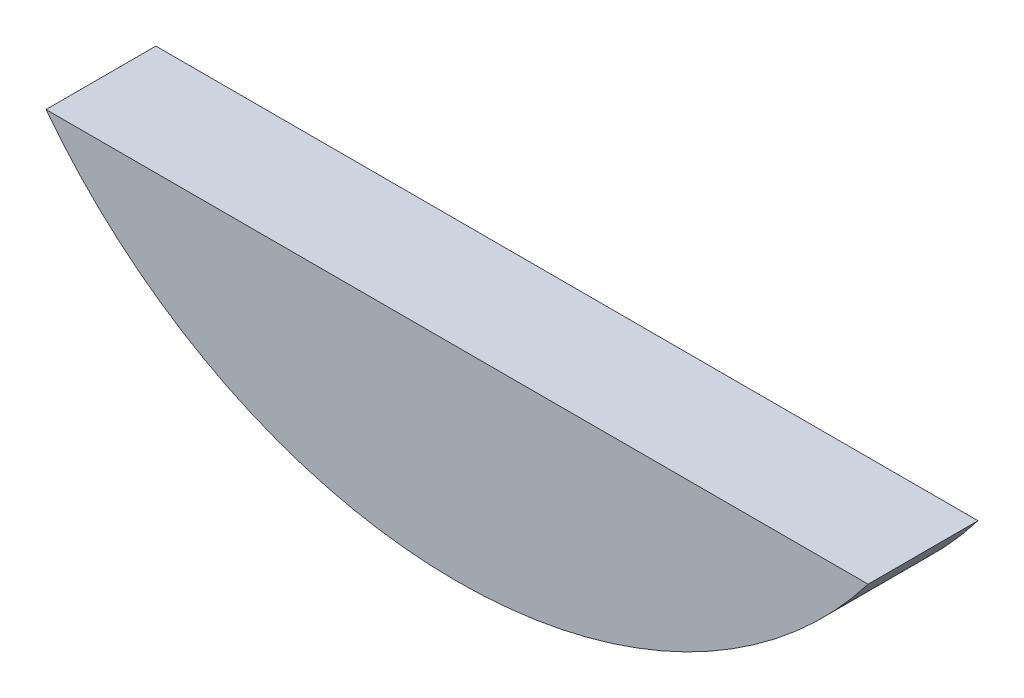
ISO-10303-21;
HEADER;
FILE_DESCRIPTION(('STEP AP214'),'2;1');
FILE_NAME('part.step','',(''),(''),'','','');
FILE_SCHEMA(('AUTOMOTIVE_DESIGN { 1 0 10303 214 1 1 1 1 }'));
ENDSEC;
DATA;
#1=APPLICATION_CONTEXT('core data for automotive mechanical design processes');
#2=APPLICATION_PROTOCOL_DEFINITION('international standard','automotive_design',2000,#1);
#3=PRODUCT_CONTEXT('',#1,'mechanical');
#4=PRODUCT('Part','Part','',(#3));
#5=PRODUCT_RELATED_PRODUCT_CATEGORY('part','',(#4));
#6=PRODUCT_DEFINITION_FORMATION('','',#4);
#7=PRODUCT_DEFINITION_CONTEXT('part definition',#1,'design');
#8=PRODUCT_DEFINITION('design','',#6,#7);
#9=PRODUCT_DEFINITION_SHAPE('','',#8);
#10=(LENGTH_UNIT() NAMED_UNIT(*) SI_UNIT(.MILLI.,.METRE.));
#11=(NAMED_UNIT(*) PLANE_ANGLE_UNIT() SI_UNIT($,.RADIAN.));
#12=(NAMED_UNIT(*) SI_UNIT($,.STERADIAN.) SOLID_ANGLE_UNIT());
#13=UNCERTAINTY_MEASURE_WITH_UNIT(LENGTH_MEASURE(1.E-05),#10,'distance_accuracy_value','');
#14=(GEOMETRIC_REPRESENTATION_CONTEXT(3) GLOBAL_UNCERTAINTY_ASSIGNED_CONTEXT((#13)) GLOBAL_UNIT_ASSIGNED_CONTEXT((#10,
#11,#12)) REPRESENTATION_CONTEXT('',''));
#15=CARTESIAN_POINT('',(0.,0.,0.));
#16=DIRECTION('',(0.,0.,1.));
#17=DIRECTION('',(1.,0.,0.));
#18=AXIS2_PLACEMENT_3D('',#15,#16,#17);
#19=CARTESIAN_POINT('',(-38.2132480426785,-5.87066719343403,0.));
#20=DIRECTION('',(0.,0.,-1.));
#21=DIRECTION('',(-1.,0.,0.));
#22=AXIS2_PLACEMENT_3D('',#19,#20,#21);
#23=PLANE('',#22);
#24=CARTESIAN_POINT('',(1.31056256658607,-3.52589015280131,0.));
#25=DIRECTION('',(0.,0.,1.));
#26=DIRECTION('',(1.,0.,0.));
#27=AXIS2_PLACEMENT_3D('',#24,#25,#26);
#28=CIRCLE('',#27,0.264962664518373);
#29=CARTESIAN_POINT('',(1.16239934406755,-3.74555551894173,0.));
#30=VERTEX_POINT('',#29);
#31=CARTESIAN_POINT('',(1.40794161013052,-3.27947072283069,0.));
#32=VERTEX_POINT('',#31);
#33=EDGE_CURVE('P0_E20',#30,#32,#28,.F.);
#34=ORIENTED_EDGE('',*,*,#33,.F.);
#35=CARTESIAN_POINT('',(0.,-5.72703044701187,0.));
#36=DIRECTION('',(0.,0.,1.));
#37=DIRECTION('',(1.,0.,0.));
#38=AXIS2_PLACEMENT_3D('',#35,#36,#37);
#39=CIRCLE('',#38,2.29726252867608);
#40=CARTESIAN_POINT('',(-1.16239934406755,-3.74555551894173,0.));
#41=VERTEX_POINT('',#40);
#42=EDGE_CURVE('P0_E72',#30,#41,#39,.F.);
#43=ORIENTED_EDGE('',*,*,#42,.T.);
#44=CARTESIAN_POINT('',(-1.31056256658607,-3.52589015280131,0.));
#45=DIRECTION('',(0.,0.,1.));
#46=DIRECTION('',(1.,0.,0.));
#47=AXIS2_PLACEMENT_3D('',#44,#45,#46);
#48=CIRCLE('',#47,0.264962664518373);
#49=CARTESIAN_POINT('',(-1.40794161013052,-3.27947072283069,0.));
#50=VERTEX_POINT('',#49);
#51=EDGE_CURVE('P0_E57',#50,#41,#48,.F.);
#52=ORIENTED_EDGE('',*,*,#51,.F.);
#53=CARTESIAN_POINT('',(0.,-5.72703044701187,0.));
#54=DIRECTION('',(0.,0.,1.));
#55=DIRECTION('',(1.,0.,0.));
#56=AXIS2_PLACEMENT_3D('',#53,#54,#55);
#57=CIRCLE('',#56,2.82362323637038);
#58=EDGE_CURVE('P0_E55',#32,#50,#57,.F.);
#59=ORIENTED_EDGE('',*,*,#58,.F.);
#60=EDGE_LOOP('',(#34,#43,#52,#59));
#61=FACE_BOUND('',#60,.T.);
#62=ADVANCED_FACE('P0_F17',(#61),#23,.F.);
#63=CARTESIAN_POINT('',(0.,-5.72703044701187,-0.0254));
#64=DIRECTION('',(0.,0.,1.));
#65=DIRECTION('',(1.,0.,0.));
#66=AXIS2_PLACEMENT_3D('',#63,#64,#65);
#67=CYLINDRICAL_SURFACE('',#66,2.82362323637038);
#68=ORIENTED_EDGE('',*,*,#58,.T.);
#69=DIRECTION('',(0.,0.,1.));
#70=VECTOR('',#69,1.);
#71=CARTESIAN_POINT('',(-1.40794161013052,-3.27947072283069,-0.0254));
#72=LINE('',#71,#70);
#73=CARTESIAN_POINT('',(-1.40794161013052,-3.27947072283069,-0.0254));
#74=VERTEX_POINT('',#73);
#75=EDGE_CURVE('P0_E62',#74,#50,#72,.T.);
#76=ORIENTED_EDGE('',*,*,#75,.F.);
#77=CARTESIAN_POINT('',(0.,-5.72703044701187,-0.0254));
#78=DIRECTION('',(0.,0.,1.));
#79=DIRECTION('',(1.,0.,0.));
#80=AXIS2_PLACEMENT_3D('',#77,#78,#79);
#81=CIRCLE('',#80,2.82362323637038);
#82=CARTESIAN_POINT('',(1.40794161013052,-3.27947072283069,-0.0254));
#83=VERTEX_POINT('',#82);
#84=EDGE_CURVE('P0_E71',#83,#74,#81,.F.);
#85=ORIENTED_EDGE('',*,*,#84,.F.);
#86=DIRECTION('',(0.,0.,1.));
#87=VECTOR('',#86,1.);
#88=CARTESIAN_POINT('',(1.40794161013052,-3.27947072283069,-0.0254));
#89=LINE('',#88,#87);
#90=EDGE_CURVE('P0_E68',#32,#83,#89,.F.);
#91=ORIENTED_EDGE('',*,*,#90,.F.);
#92=EDGE_LOOP('',(#68,#76,#85,#91));
#93=FACE_BOUND('',#92,.T.);
#94=ADVANCED_FACE('P0_F70',(#93),#67,.T.);
#95=CARTESIAN_POINT('',(-1.31056256658607,-3.52589015280131,-0.0254));
#96=DIRECTION('',(0.,0.,1.));
#97=DIRECTION('',(1.,0.,0.));
#98=AXIS2_PLACEMENT_3D('',#95,#96,#97);
#99=CYLINDRICAL_SURFACE('',#98,0.264962664518373);
#100=ORIENTED_EDGE('',*,*,#51,.T.);
#101=DIRECTION('',(0.,0.,1.));
#102=VECTOR('',#101,1.);
#103=CARTESIAN_POINT('',(-1.16239934406755,-3.74555551894173,-0.0254));
#104=LINE('',#103,#102);
#105=CARTESIAN_POINT('',(-1.16239934406755,-3.74555551894173,-0.0254));
#106=VERTEX_POINT('',#105);
#107=EDGE_CURVE('P0_E75',#41,#106,#104,.F.);
#108=ORIENTED_EDGE('',*,*,#107,.T.);
#109=CARTESIAN_POINT('',(-1.31056256658607,-3.52589015280131,-0.0254));
#110=DIRECTION('',(0.,0.,1.));
#111=DIRECTION('',(1.,0.,0.));
#112=AXIS2_PLACEMENT_3D('',#109,#110,#111);
#113=CIRCLE('',#112,0.264962664518373);
#114=EDGE_CURVE('P0_E82',#74,#106,#113,.F.);
#115=ORIENTED_EDGE('',*,*,#114,.F.);
#116=ORIENTED_EDGE('',*,*,#75,.T.);
#117=EDGE_LOOP('',(#100,#108,#115,#116));
#118=FACE_BOUND('',#117,.T.);
#119=ADVANCED_FACE('P0_F87',(#118),#99,.T.);
#120=CARTESIAN_POINT('',(0.,-5.72703044701187,-0.0254));
#121=DIRECTION('',(0.,0.,1.));
#122=DIRECTION('',(1.,0.,0.));
#123=AXIS2_PLACEMENT_3D('',#120,#121,#122);
#124=CYLINDRICAL_SURFACE('',#123,2.29726252867608);
#125=DIRECTION('',(0.,0.,1.));
#126=VECTOR('',#125,1.);
#127=CARTESIAN_POINT('',(1.16239934406755,-3.74555551894173,-0.0254));
#128=LINE('',#127,#126);
#129=CARTESIAN_POINT('',(1.16239934406755,-3.74555551894173,-0.0254));
#130=VERTEX_POINT('',#129);
#131=EDGE_CURVE('P0_E69',#130,#30,#128,.T.);
#132=ORIENTED_EDGE('',*,*,#131,.F.);
#133=CARTESIAN_POINT('',(0.,-5.72703044701187,-0.0254));
#134=DIRECTION('',(0.,0.,1.));
#135=DIRECTION('',(1.,0.,0.));
#136=AXIS2_PLACEMENT_3D('',#133,#134,#135);
#137=CIRCLE('',#136,2.29726252867608);
#138=EDGE_CURVE('P0_E26',#106,#130,#137,.T.);
#139=ORIENTED_EDGE('',*,*,#138,.F.);
#140=ORIENTED_EDGE('',*,*,#107,.F.);
#141=ORIENTED_EDGE('',*,*,#42,.F.);
#142=EDGE_LOOP('',(#132,#139,#140,#141));
#143=FACE_BOUND('',#142,.T.);
#144=ADVANCED_FACE('P0_F90',(#143),#124,.F.);
#145=CARTESIAN_POINT('',(1.31056256658607,-3.52589015280131,-0.0254));
#146=DIRECTION('',(0.,0.,1.));
#147=DIRECTION('',(1.,0.,0.));
#148=AXIS2_PLACEMENT_3D('',#145,#146,#147);
#149=CYLINDRICAL_SURFACE('',#148,0.264962664518373);
#150=CARTESIAN_POINT('',(1.31056256658607,-3.52589015280131,-0.0254));
#151=DIRECTION('',(0.,0.,1.));
#152=DIRECTION('',(1.,0.,0.));
#153=AXIS2_PLACEMENT_3D('',#150,#151,#152);
#154=CIRCLE('',#153,0.264962664518373);
#155=EDGE_CURVE('P0_E11',#130,#83,#154,.F.);
#156=ORIENTED_EDGE('',*,*,#155,.F.);
#157=ORIENTED_EDGE('',*,*,#131,.T.);
#158=ORIENTED_EDGE('',*,*,#33,.T.);
#159=ORIENTED_EDGE('',*,*,#90,.T.);
#160=EDGE_LOOP('',(#156,#157,#158,#159));
#161=FACE_BOUND('',#160,.T.);
#162=ADVANCED_FACE('P0_F67',(#161),#149,.T.);
#163=CARTESIAN_POINT('',(-38.2132480426785,-5.87066719343403,-0.0254));
#164=DIRECTION('',(0.,0.,-1.));
#165=DIRECTION('',(-1.,0.,0.));
#166=AXIS2_PLACEMENT_3D('',#163,#164,#165);
#167=PLANE('',#166);
#168=ORIENTED_EDGE('',*,*,#138,.T.);
#169=ORIENTED_EDGE('',*,*,#155,.T.);
#170=ORIENTED_EDGE('',*,*,#84,.T.);
#171=ORIENTED_EDGE('',*,*,#114,.T.);
#172=EDGE_LOOP('',(#168,#169,#170,#171));
#173=FACE_BOUND('',#172,.T.);
#174=ADVANCED_FACE('P0_F91',(#173),#167,.T.);
#175=CLOSED_SHELL('',(#62,#94,#119,#144,#162,#174));
#176=MANIFOLD_SOLID_BREP('P0_B1',#175);
#177=CARTESIAN_POINT('',(0.,-53.3944236345631,0.));
#178=DIRECTION('',(0.,0.,1.));
#179=DIRECTION('',(1.,0.,0.));
#180=AXIS2_PLACEMENT_3D('',#177,#178,#179);
#181=PLANE('',#180);
#182=CARTESIAN_POINT('',(0.,18.1677984931941,0.));
#183=DIRECTION('',(0.,0.,-1.));
#184=DIRECTION('',(-1.,0.,0.));
#185=AXIS2_PLACEMENT_3D('',#182,#183,#184);
#186=CIRCLE('',#185,29.9091328800622);
#187=CARTESIAN_POINT('',(-23.7589420544752,0.,0.));
#188=VERTEX_POINT('',#187);
#189=CARTESIAN_POINT('',(23.7589420544752,0.,0.));
#190=VERTEX_POINT('',#189);
#191=EDGE_CURVE('P1_E20',#188,#190,#186,.F.);
#192=ORIENTED_EDGE('',*,*,#191,.F.);
#193=DIRECTION('',(1.,0.,0.));
#194=VECTOR('',#193,1.);
#195=CARTESIAN_POINT('',(0.,0.,0.));
#196=LINE('',#195,#194);
#197=EDGE_CURVE('P1_E42',#190,#188,#196,.F.);
#198=ORIENTED_EDGE('',*,*,#197,.F.);
#199=EDGE_LOOP('',(#192,#198));
#200=FACE_BOUND('',#199,.T.);
#201=ADVANCED_FACE('P1_F17',(#200),#181,.F.);
#202=CARTESIAN_POINT('',(0.,0.,6.35));
#203=DIRECTION('',(0.,1.,0.));
#204=DIRECTION('',(0.,0.,1.));
#205=AXIS2_PLACEMENT_3D('',#202,#203,#204);
#206=PLANE('',#205);
#207=DIRECTION('',(1.,0.,0.));
#208=VECTOR('',#207,1.);
#209=CARTESIAN_POINT('',(0.,0.,6.35));
#210=LINE('',#209,#208);
#211=CARTESIAN_POINT('',(23.7589420544752,0.,6.35));
#212=VERTEX_POINT('',#211);
#213=CARTESIAN_POINT('',(-23.7589420544752,0.,6.35));
#214=VERTEX_POINT('',#213);
#215=EDGE_CURVE('P1_E26',#212,#214,#210,.F.);
#216=ORIENTED_EDGE('',*,*,#215,.F.);
#217=DIRECTION('',(0.,0.,-1.));
#218=VECTOR('',#217,1.);
#219=CARTESIAN_POINT('',(23.7589420544752,0.,6.35));
#220=LINE('',#219,#218);
#221=EDGE_CURVE('P1_E46',#190,#212,#220,.F.);
#222=ORIENTED_EDGE('',*,*,#221,.F.);
#223=ORIENTED_EDGE('',*,*,#197,.T.);
#224=DIRECTION('',(0.,0.,-1.));
#225=VECTOR('',#224,1.);
#226=CARTESIAN_POINT('',(-23.7589420544752,0.,6.35));
#227=LINE('',#226,#225);
#228=EDGE_CURVE('P1_E34',#214,#188,#227,.T.);
#229=ORIENTED_EDGE('',*,*,#228,.F.);
#230=EDGE_LOOP('',(#216,#222,#223,#229));
#231=FACE_BOUND('',#230,.T.);
#232=ADVANCED_FACE('P1_F47',(#231),#206,.T.);
#233=CARTESIAN_POINT('',(0.,18.1677984931941,6.35));
#234=DIRECTION('',(0.,0.,-1.));
#235=DIRECTION('',(-1.,0.,0.));
#236=AXIS2_PLACEMENT_3D('',#233,#234,#235);
#237=CYLINDRICAL_SURFACE('',#236,29.9091328800622);
#238=CARTESIAN_POINT('',(0.,18.1677984931941,6.35));
#239=DIRECTION('',(0.,0.,-1.));
#240=DIRECTION('',(-1.,0.,0.));
#241=AXIS2_PLACEMENT_3D('',#238,#239,#240);
#242=CIRCLE('',#241,29.9091328800622);
#243=EDGE_CURVE('P1_E11',#214,#212,#242,.F.);
#244=ORIENTED_EDGE('',*,*,#243,.F.);
#245=ORIENTED_EDGE('',*,*,#228,.T.);
#246=ORIENTED_EDGE('',*,*,#191,.T.);
#247=ORIENTED_EDGE('',*,*,#221,.T.);
#248=EDGE_LOOP('',(#244,#245,#246,#247));
#249=FACE_BOUND('',#248,.T.);
#250=ADVANCED_FACE('P1_F51',(#249),#237,.T.);
#251=CARTESIAN_POINT('',(0.,-53.3944236345631,6.35));
#252=DIRECTION('',(0.,0.,1.));
#253=DIRECTION('',(1.,0.,0.));
#254=AXIS2_PLACEMENT_3D('',#251,#252,#253);
#255=PLANE('',#254);
#256=ORIENTED_EDGE('',*,*,#215,.T.);
#257=ORIENTED_EDGE('',*,*,#243,.T.);
#258=EDGE_LOOP('',(#256,#257));
#259=FACE_BOUND('',#258,.T.);
#260=ADVANCED_FACE('P1_F55',(#259),#255,.T.);
#261=CLOSED_SHELL('',(#201,#232,#250,#260));
#262=MANIFOLD_SOLID_BREP('P1_B1',#261);
#263=CARTESIAN_POINT('',(-38.2132480426785,-5.87066719343403,0.));
#264=DIRECTION('',(0.,0.,-1.));
#265=DIRECTION('',(-1.,0.,0.));
#266=AXIS2_PLACEMENT_3D('',#263,#264,#265);
#267=PLANE('',#266);
#268=CARTESIAN_POINT('',(0.,-5.07123732753464,0.));
#269=DIRECTION('',(0.,0.,1.));
#270=DIRECTION('',(1.,0.,0.));
#271=AXIS2_PLACEMENT_3D('',#268,#269,#270);
#272=CIRCLE('',#271,0.254);
#273=CARTESIAN_POINT('',(0.253999999999999,-5.07123732753464,0.));
#274=VERTEX_POINT('',#273);
#275=CARTESIAN_POINT('',(-0.253999999999999,-5.07123732753464,0.));
#276=VERTEX_POINT('',#275);
#277=EDGE_CURVE('P2_E20',#274,#276,#272,.F.);
#278=ORIENTED_EDGE('',*,*,#277,.F.);
#279=DIRECTION('',(0.,1.,0.));
#280=VECTOR('',#279,1.);
#281=CARTESIAN_POINT('',(0.253999999999997,-5.87066719343403,0.));
#282=LINE('',#281,#280);
#283=CARTESIAN_POINT('',(0.253999999999997,-2.4115043831865,0.));
#284=VERTEX_POINT('',#283);
#285=EDGE_CURVE('P2_E71',#274,#284,#282,.T.);
#286=ORIENTED_EDGE('',*,*,#285,.T.);
#287=CARTESIAN_POINT('',(0.,-2.4115043831865,0.));
#288=DIRECTION('',(0.,0.,1.));
#289=DIRECTION('',(1.,0.,0.));
#290=AXIS2_PLACEMENT_3D('',#287,#288,#289);
#291=CIRCLE('',#290,0.254);
#292=CARTESIAN_POINT('',(-0.253999999999999,-2.4115043831865,0.));
#293=VERTEX_POINT('',#292);
#294=EDGE_CURVE('P2_E64',#293,#284,#291,.F.);
#295=ORIENTED_EDGE('',*,*,#294,.F.);
#296=DIRECTION('',(0.,1.,0.));
#297=VECTOR('',#296,1.);
#298=CARTESIAN_POINT('',(-0.253999999999997,-5.87066719343403,0.));
#299=LINE('',#298,#297);
#300=EDGE_CURVE('P2_E62',#276,#293,#299,.T.);
#301=ORIENTED_EDGE('',*,*,#300,.F.);
#302=EDGE_LOOP('',(#278,#286,#295,#301));
#303=FACE_BOUND('',#302,.T.);
#304=ADVANCED_FACE('P2_F17',(#303),#267,.F.);
#305=CARTESIAN_POINT('',(-0.253999999999997,-5.87066719343403,-0.0254));
#306=DIRECTION('',(-1.,0.,0.));
#307=DIRECTION('',(0.,0.,1.));
#308=AXIS2_PLACEMENT_3D('',#305,#306,#307);
#309=PLANE('',#308);
#310=DIRECTION('',(0.,1.,0.));
#311=VECTOR('',#310,1.);
#312=CARTESIAN_POINT('',(-0.253999999999997,-5.87066719343403,-0.0254));
#313=LINE('',#312,#311);
#314=CARTESIAN_POINT('',(-0.253999999999999,-5.07123732753464,-0.0254));
#315=VERTEX_POINT('',#314);
#316=CARTESIAN_POINT('',(-0.253999999999999,-2.4115043831865,-0.0254));
#317=VERTEX_POINT('',#316);
#318=EDGE_CURVE('P2_E70',#315,#317,#313,.T.);
#319=ORIENTED_EDGE('',*,*,#318,.F.);
#320=DIRECTION('',(0.,0.,1.));
#321=VECTOR('',#320,1.);
#322=CARTESIAN_POINT('',(-0.254,-5.07123732753464,-0.0254));
#323=LINE('',#322,#321);
#324=EDGE_CURVE('P2_E61',#276,#315,#323,.F.);
#325=ORIENTED_EDGE('',*,*,#324,.F.);
#326=ORIENTED_EDGE('',*,*,#300,.T.);
#327=DIRECTION('',(0.,0.,1.));
#328=VECTOR('',#327,1.);
#329=CARTESIAN_POINT('',(-0.254,-2.4115043831865,-0.0254));
#330=LINE('',#329,#328);
#331=EDGE_CURVE('P2_E80',#317,#293,#330,.T.);
#332=ORIENTED_EDGE('',*,*,#331,.F.);
#333=EDGE_LOOP('',(#319,#325,#326,#332));
#334=FACE_BOUND('',#333,.T.);
#335=ADVANCED_FACE('P2_F68',(#334),#309,.T.);
#336=CARTESIAN_POINT('',(0.,-2.4115043831865,-0.0254));
#337=DIRECTION('',(0.,0.,1.));
#338=DIRECTION('',(1.,0.,0.));
#339=AXIS2_PLACEMENT_3D('',#336,#337,#338);
#340=CYLINDRICAL_SURFACE('',#339,0.254);
#341=CARTESIAN_POINT('',(0.,-2.4115043831865,-0.0254));
#342=DIRECTION('',(0.,0.,1.));
#343=DIRECTION('',(1.,0.,0.));
#344=AXIS2_PLACEMENT_3D('',#341,#342,#343);
#345=CIRCLE('',#344,0.254);
#346=CARTESIAN_POINT('',(0.253999999999997,-2.4115043831865,-0.0254));
#347=VERTEX_POINT('',#346);
#348=EDGE_CURVE('P2_E82',#317,#347,#345,.F.);
#349=ORIENTED_EDGE('',*,*,#348,.F.);
#350=ORIENTED_EDGE('',*,*,#331,.T.);
#351=ORIENTED_EDGE('',*,*,#294,.T.);
#352=DIRECTION('',(0.,0.,1.));
#353=VECTOR('',#352,1.);
#354=CARTESIAN_POINT('',(0.253999999999997,-2.4115043831865,-0.0254));
#355=LINE('',#354,#353);
#356=EDGE_CURVE('P2_E74',#284,#347,#355,.F.);
#357=ORIENTED_EDGE('',*,*,#356,.T.);
#358=EDGE_LOOP('',(#349,#350,#351,#357));
#359=FACE_BOUND('',#358,.T.);
#360=ADVANCED_FACE('P2_F86',(#359),#340,.T.);
#361=CARTESIAN_POINT('',(0.253999999999997,-5.87066719343403,-0.0254));
#362=DIRECTION('',(-1.,0.,0.));
#363=DIRECTION('',(0.,0.,1.));
#364=AXIS2_PLACEMENT_3D('',#361,#362,#363);
#365=PLANE('',#364);
#366=DIRECTION('',(0.,0.,1.));
#367=VECTOR('',#366,1.);
#368=CARTESIAN_POINT('',(0.254,-5.07123732753464,-0.0254));
#369=LINE('',#368,#367);
#370=CARTESIAN_POINT('',(0.253999999999999,-5.07123732753464,-0.0254));
#371=VERTEX_POINT('',#370);
#372=EDGE_CURVE('P2_E35',#371,#274,#369,.T.);
#373=ORIENTED_EDGE('',*,*,#372,.F.);
#374=DIRECTION('',(0.,1.,0.));
#375=VECTOR('',#374,1.);
#376=CARTESIAN_POINT('',(0.253999999999997,-5.87066719343403,-0.0254));
#377=LINE('',#376,#375);
#378=EDGE_CURVE('P2_E26',#347,#371,#377,.F.);
#379=ORIENTED_EDGE('',*,*,#378,.F.);
#380=ORIENTED_EDGE('',*,*,#356,.F.);
#381=ORIENTED_EDGE('',*,*,#285,.F.);
#382=EDGE_LOOP('',(#373,#379,#380,#381));
#383=FACE_BOUND('',#382,.T.);
#384=ADVANCED_FACE('P2_F88',(#383),#365,.F.);
#385=CARTESIAN_POINT('',(0.,-5.07123732753464,-0.0254));
#386=DIRECTION('',(0.,0.,1.));
#387=DIRECTION('',(1.,0.,0.));
#388=AXIS2_PLACEMENT_3D('',#385,#386,#387);
#389=CYLINDRICAL_SURFACE('',#388,0.254);
#390=CARTESIAN_POINT('',(0.,-5.07123732753464,-0.0254));
#391=DIRECTION('',(0.,0.,1.));
#392=DIRECTION('',(1.,0.,0.));
#393=AXIS2_PLACEMENT_3D('',#390,#391,#392);
#394=CIRCLE('',#393,0.254);
#395=EDGE_CURVE('P2_E11',#371,#315,#394,.F.);
#396=ORIENTED_EDGE('',*,*,#395,.F.);
#397=ORIENTED_EDGE('',*,*,#372,.T.);
#398=ORIENTED_EDGE('',*,*,#277,.T.);
#399=ORIENTED_EDGE('',*,*,#324,.T.);
#400=EDGE_LOOP('',(#396,#397,#398,#399));
#401=FACE_BOUND('',#400,.T.);
#402=ADVANCED_FACE('P2_F59',(#401),#389,.T.);
#403=CARTESIAN_POINT('',(-38.2132480426785,-5.87066719343403,-0.0254));
#404=DIRECTION('',(0.,0.,-1.));
#405=DIRECTION('',(-1.,0.,0.));
#406=AXIS2_PLACEMENT_3D('',#403,#404,#405);
#407=PLANE('',#406);
#408=ORIENTED_EDGE('',*,*,#378,.T.);
#409=ORIENTED_EDGE('',*,*,#395,.T.);
#410=ORIENTED_EDGE('',*,*,#318,.T.);
#411=ORIENTED_EDGE('',*,*,#348,.T.);
#412=EDGE_LOOP('',(#408,#409,#410,#411));
#413=FACE_BOUND('',#412,.T.);
#414=ADVANCED_FACE('P2_F91',(#413),#407,.T.);
#415=CLOSED_SHELL('',(#304,#335,#360,#384,#402,#414));
#416=MANIFOLD_SOLID_BREP('P2_B1',#415);
#417=ADVANCED_BREP_SHAPE_REPRESENTATION('',(#18,#176,#262,#416),#14);
#418=SHAPE_DEFINITION_REPRESENTATION(#9,#417);
ENDSEC;
END-ISO-10303-21;
